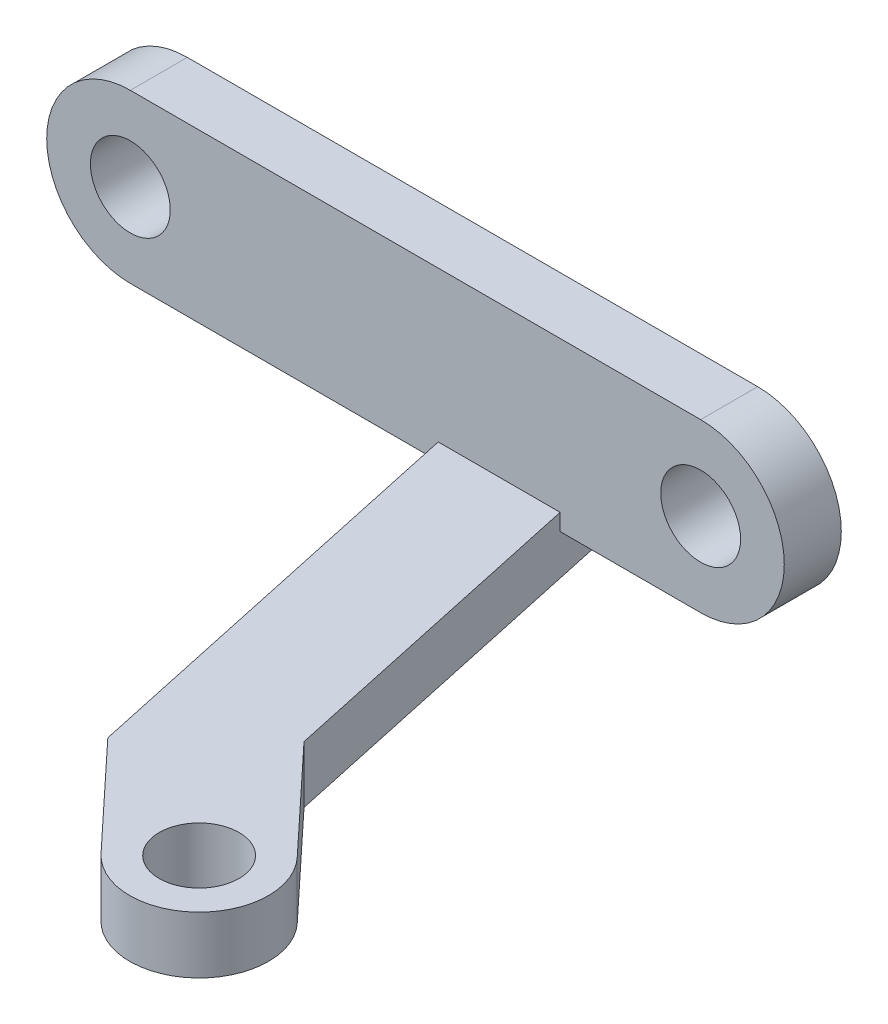
ISO-10303-21;
HEADER;
FILE_DESCRIPTION(('STEP AP214'),'2;1');
FILE_NAME('part.step','',(''),(''),'','','');
FILE_SCHEMA(('AUTOMOTIVE_DESIGN { 1 0 10303 214 1 1 1 1 }'));
ENDSEC;
DATA;
#1=APPLICATION_CONTEXT('core data for automotive mechanical design processes');
#2=APPLICATION_PROTOCOL_DEFINITION('international standard','automotive_design',2000,#1);
#3=PRODUCT_CONTEXT('',#1,'mechanical');
#4=PRODUCT('Part','Part','',(#3));
#5=PRODUCT_RELATED_PRODUCT_CATEGORY('part','',(#4));
#6=PRODUCT_DEFINITION_FORMATION('','',#4);
#7=PRODUCT_DEFINITION_CONTEXT('part definition',#1,'design');
#8=PRODUCT_DEFINITION('design','',#6,#7);
#9=PRODUCT_DEFINITION_SHAPE('','',#8);
#10=(LENGTH_UNIT() NAMED_UNIT(*) SI_UNIT(.MILLI.,.METRE.));
#11=(NAMED_UNIT(*) PLANE_ANGLE_UNIT() SI_UNIT($,.RADIAN.));
#12=(NAMED_UNIT(*) SI_UNIT($,.STERADIAN.) SOLID_ANGLE_UNIT());
#13=UNCERTAINTY_MEASURE_WITH_UNIT(LENGTH_MEASURE(1.E-05),#10,'distance_accuracy_value','');
#14=(GEOMETRIC_REPRESENTATION_CONTEXT(3) GLOBAL_UNCERTAINTY_ASSIGNED_CONTEXT((#13)) GLOBAL_UNIT_ASSIGNED_CONTEXT((#10,
#11,#12)) REPRESENTATION_CONTEXT('',''));
#15=CARTESIAN_POINT('',(0.,0.,0.));
#16=DIRECTION('',(0.,0.,1.));
#17=DIRECTION('',(1.,0.,0.));
#18=AXIS2_PLACEMENT_3D('',#15,#16,#17);
#19=CARTESIAN_POINT('',(-51.4512469253855,1.0464477785419,2.5));
#20=DIRECTION('',(0.,1.,0.));
#21=DIRECTION('',(-1.,0.,0.));
#22=AXIS2_PLACEMENT_3D('',#19,#20,#21);
#23=PLANE('',#22);
#24=DIRECTION('',(1.,0.,0.));
#25=VECTOR('',#24,1.);
#26=CARTESIAN_POINT('',(-51.4512469253855,1.0464477785419,0.));
#27=LINE('',#26,#25);
#28=CARTESIAN_POINT('',(-76.4512469253855,1.0464477785419,0.));
#29=VERTEX_POINT('',#28);
#30=CARTESIAN_POINT('',(-63.492403414898,1.0464477785419,0.));
#31=VERTEX_POINT('',#30);
#32=EDGE_CURVE('E218',#29,#31,#27,.T.);
#33=ORIENTED_EDGE('',*,*,#32,.T.);
#34=DIRECTION('',(0.211022743594743,0.,0.977481151575695));
#35=VECTOR('',#34,1.);
#36=CARTESIAN_POINT('',(-62.4405266259804,1.0464477785419,4.87241193736713));
#37=LINE('',#36,#35);
#38=CARTESIAN_POINT('',(-62.9526928965556,1.0464477785419,2.5));
#39=VERTEX_POINT('',#38);
#40=EDGE_CURVE('E11',#31,#39,#37,.T.);
#41=ORIENTED_EDGE('',*,*,#40,.T.);
#42=DIRECTION('',(1.,0.,0.));
#43=VECTOR('',#42,1.);
#44=CARTESIAN_POINT('',(-51.4512469253855,1.0464477785419,2.5));
#45=LINE('',#44,#43);
#46=CARTESIAN_POINT('',(-76.4512469253855,1.0464477785419,2.5));
#47=VERTEX_POINT('',#46);
#48=EDGE_CURVE('E222',#47,#39,#45,.T.);
#49=ORIENTED_EDGE('',*,*,#48,.F.);
#50=DIRECTION('',(0.,0.,-1.));
#51=VECTOR('',#50,1.);
#52=CARTESIAN_POINT('',(-76.4512469253855,1.0464477785419,2.5));
#53=LINE('',#52,#51);
#54=EDGE_CURVE('E235',#47,#29,#53,.T.);
#55=ORIENTED_EDGE('',*,*,#54,.T.);
#56=EDGE_LOOP('',(#33,#41,#49,#55));
#57=FACE_BOUND('',#56,.T.);
#58=ADVANCED_FACE('F35',(#57),#23,.F.);
#59=CARTESIAN_POINT('',(-51.4512469253855,4.71199999999999,2.5));
#60=DIRECTION('',(0.,0.,1.));
#61=DIRECTION('',(1.,0.,0.));
#62=AXIS2_PLACEMENT_3D('',#59,#60,#61);
#63=PLANE('',#62);
#64=DIRECTION('',(0.,-1.,0.));
#65=VECTOR('',#64,1.);
#66=CARTESIAN_POINT('',(-62.9526928965556,4.71199999999999,2.5));
#67=LINE('',#66,#65);
#68=CARTESIAN_POINT('',(-62.9526928965556,1.77777892340318,2.5));
#69=VERTEX_POINT('',#68);
#70=EDGE_CURVE('E198',#69,#39,#67,.T.);
#71=ORIENTED_EDGE('',*,*,#70,.F.);
#72=DIRECTION('',(1.,0.,0.));
#73=VECTOR('',#72,1.);
#74=CARTESIAN_POINT('',(-51.4512469253855,1.77777892340319,2.5));
#75=LINE('',#74,#73);
#76=CARTESIAN_POINT('',(-57.60992302724,1.77777892340319,2.5));
#77=VERTEX_POINT('',#76);
#78=EDGE_CURVE('E200',#69,#77,#75,.T.);
#79=ORIENTED_EDGE('',*,*,#78,.T.);
#80=DIRECTION('',(0.,1.,0.));
#81=VECTOR('',#80,1.);
#82=CARTESIAN_POINT('',(-57.60992302724,4.71199999999999,2.5));
#83=LINE('',#82,#81);
#84=CARTESIAN_POINT('',(-57.60992302724,1.0464477785419,2.5));
#85=VERTEX_POINT('',#84);
#86=EDGE_CURVE('E145',#85,#77,#83,.T.);
#87=ORIENTED_EDGE('',*,*,#86,.F.);
#88=CARTESIAN_POINT('',(-51.4512469253855,1.0464477785419,2.5));
#89=VERTEX_POINT('',#88);
#90=EDGE_CURVE('E59',#85,#89,#45,.T.);
#91=ORIENTED_EDGE('',*,*,#90,.T.);
#92=CARTESIAN_POINT('',(-51.4512469253855,4.71199999999999,2.5));
#93=DIRECTION('',(0.,0.,1.));
#94=DIRECTION('',(1.,0.,0.));
#95=AXIS2_PLACEMENT_3D('',#92,#93,#94);
#96=CIRCLE('',#95,3.66555222145809);
#97=CARTESIAN_POINT('',(-51.4512469253855,8.37755222145808,2.5));
#98=VERTEX_POINT('',#97);
#99=EDGE_CURVE('E216',#89,#98,#96,.T.);
#100=ORIENTED_EDGE('',*,*,#99,.T.);
#101=DIRECTION('',(-1.,0.,0.));
#102=VECTOR('',#101,1.);
#103=CARTESIAN_POINT('',(-51.4512469253855,8.37755222145808,2.5));
#104=LINE('',#103,#102);
#105=CARTESIAN_POINT('',(-76.4512469253855,8.37755222145809,2.5));
#106=VERTEX_POINT('',#105);
#107=EDGE_CURVE('E88',#98,#106,#104,.T.);
#108=ORIENTED_EDGE('',*,*,#107,.T.);
#109=CARTESIAN_POINT('',(-76.4512469253855,4.71199999999999,2.5));
#110=DIRECTION('',(0.,0.,1.));
#111=DIRECTION('',(1.,0.,0.));
#112=AXIS2_PLACEMENT_3D('',#109,#110,#111);
#113=CIRCLE('',#112,3.66555222145809);
#114=EDGE_CURVE('E220',#106,#47,#113,.T.);
#115=ORIENTED_EDGE('',*,*,#114,.T.);
#116=ORIENTED_EDGE('',*,*,#48,.T.);
#117=EDGE_LOOP('',(#71,#79,#87,#91,#100,#108,#115,#116));
#118=FACE_BOUND('',#117,.T.);
#119=CARTESIAN_POINT('',(-76.4512469253855,4.71199999999999,2.5));
#120=DIRECTION('',(0.,0.,1.));
#121=DIRECTION('',(1.,0.,0.));
#122=AXIS2_PLACEMENT_3D('',#119,#120,#121);
#123=CIRCLE('',#122,1.75);
#124=CARTESIAN_POINT('',(-74.7012469253855,4.71199999999999,2.5));
#125=VERTEX_POINT('',#124);
#126=EDGE_CURVE('E210',#125,#125,#123,.T.);
#127=ORIENTED_EDGE('',*,*,#126,.F.);
#128=EDGE_LOOP('',(#127));
#129=FACE_BOUND('',#128,.T.);
#130=CARTESIAN_POINT('',(-51.4512469253855,4.71199999999999,2.5));
#131=DIRECTION('',(0.,0.,1.));
#132=DIRECTION('',(1.,0.,0.));
#133=AXIS2_PLACEMENT_3D('',#130,#131,#132);
#134=CIRCLE('',#133,1.75000000000001);
#135=CARTESIAN_POINT('',(-49.7012469253855,4.71199999999999,2.5));
#136=VERTEX_POINT('',#135);
#137=EDGE_CURVE('E204',#136,#136,#134,.T.);
#138=ORIENTED_EDGE('',*,*,#137,.F.);
#139=EDGE_LOOP('',(#138));
#140=FACE_BOUND('',#139,.T.);
#141=ADVANCED_FACE('F253',(#118,#129,#140),#63,.T.);
#142=CARTESIAN_POINT('',(-51.4512469253855,4.71199999999999,0.));
#143=DIRECTION('',(0.,0.,1.));
#144=DIRECTION('',(1.,0.,0.));
#145=AXIS2_PLACEMENT_3D('',#142,#143,#144);
#146=PLANE('',#145);
#147=DIRECTION('',(0.,1.,0.));
#148=VECTOR('',#147,1.);
#149=CARTESIAN_POINT('',(-63.492403414898,-0.722221076596819,0.));
#150=LINE('',#149,#148);
#151=CARTESIAN_POINT('',(-63.492403414898,-0.722221076596819,0.));
#152=VERTEX_POINT('',#151);
#153=EDGE_CURVE('E193',#152,#31,#150,.T.);
#154=ORIENTED_EDGE('',*,*,#153,.T.);
#155=ORIENTED_EDGE('',*,*,#32,.F.);
#156=CARTESIAN_POINT('',(-76.4512469253855,4.71199999999999,0.));
#157=DIRECTION('',(0.,0.,1.));
#158=DIRECTION('',(1.,0.,0.));
#159=AXIS2_PLACEMENT_3D('',#156,#157,#158);
#160=CIRCLE('',#159,3.66555222145809);
#161=CARTESIAN_POINT('',(-76.4512469253855,8.37755222145809,0.));
#162=VERTEX_POINT('',#161);
#163=EDGE_CURVE('E230',#162,#29,#160,.T.);
#164=ORIENTED_EDGE('',*,*,#163,.F.);
#165=DIRECTION('',(-1.,0.,0.));
#166=VECTOR('',#165,1.);
#167=CARTESIAN_POINT('',(-51.4512469253855,8.37755222145808,0.));
#168=LINE('',#167,#166);
#169=CARTESIAN_POINT('',(-51.4512469253855,8.37755222145808,0.));
#170=VERTEX_POINT('',#169);
#171=EDGE_CURVE('E228',#170,#162,#168,.T.);
#172=ORIENTED_EDGE('',*,*,#171,.F.);
#173=CARTESIAN_POINT('',(-51.4512469253855,4.71199999999999,0.));
#174=DIRECTION('',(0.,0.,1.));
#175=DIRECTION('',(1.,0.,0.));
#176=AXIS2_PLACEMENT_3D('',#173,#174,#175);
#177=CIRCLE('',#176,3.66555222145809);
#178=CARTESIAN_POINT('',(-51.4512469253855,1.0464477785419,0.));
#179=VERTEX_POINT('',#178);
#180=EDGE_CURVE('E213',#179,#170,#177,.T.);
#181=ORIENTED_EDGE('',*,*,#180,.F.);
#182=CARTESIAN_POINT('',(-58.1496335455825,1.0464477785419,0.));
#183=VERTEX_POINT('',#182);
#184=EDGE_CURVE('E80',#183,#179,#27,.T.);
#185=ORIENTED_EDGE('',*,*,#184,.F.);
#186=DIRECTION('',(0.,1.,0.));
#187=VECTOR('',#186,1.);
#188=CARTESIAN_POINT('',(-58.1496335455824,-0.722221076596816,0.));
#189=LINE('',#188,#187);
#190=CARTESIAN_POINT('',(-58.1496335455824,-0.722221076596816,0.));
#191=VERTEX_POINT('',#190);
#192=EDGE_CURVE('E50',#191,#183,#189,.T.);
#193=ORIENTED_EDGE('',*,*,#192,.F.);
#194=DIRECTION('',(-1.,0.,0.));
#195=VECTOR('',#194,1.);
#196=CARTESIAN_POINT('',(0.,-0.722221076596789,0.));
#197=LINE('',#196,#195);
#198=EDGE_CURVE('E164',#191,#152,#197,.T.);
#199=ORIENTED_EDGE('',*,*,#198,.T.);
#200=EDGE_LOOP('',(#154,#155,#164,#172,#181,#185,#193,#199));
#201=FACE_BOUND('',#200,.T.);
#202=CARTESIAN_POINT('',(-76.4512469253855,4.71199999999999,0.));
#203=DIRECTION('',(0.,0.,1.));
#204=DIRECTION('',(1.,0.,0.));
#205=AXIS2_PLACEMENT_3D('',#202,#203,#204);
#206=CIRCLE('',#205,1.75);
#207=CARTESIAN_POINT('',(-74.7012469253855,4.71199999999999,0.));
#208=VERTEX_POINT('',#207);
#209=EDGE_CURVE('E207',#208,#208,#206,.T.);
#210=ORIENTED_EDGE('',*,*,#209,.T.);
#211=EDGE_LOOP('',(#210));
#212=FACE_BOUND('',#211,.T.);
#213=CARTESIAN_POINT('',(-51.4512469253855,4.71199999999999,0.));
#214=DIRECTION('',(0.,0.,1.));
#215=DIRECTION('',(1.,0.,0.));
#216=AXIS2_PLACEMENT_3D('',#213,#214,#215);
#217=CIRCLE('',#216,1.75000000000001);
#218=CARTESIAN_POINT('',(-49.7012469253855,4.71199999999999,0.));
#219=VERTEX_POINT('',#218);
#220=EDGE_CURVE('E203',#219,#219,#217,.T.);
#221=ORIENTED_EDGE('',*,*,#220,.T.);
#222=EDGE_LOOP('',(#221));
#223=FACE_BOUND('',#222,.T.);
#224=ADVANCED_FACE('F245',(#201,#212,#223),#146,.F.);
#225=CARTESIAN_POINT('',(-51.4512469253855,4.71199999999999,2.5));
#226=DIRECTION('',(0.,0.,-1.));
#227=DIRECTION('',(-1.,0.,0.));
#228=AXIS2_PLACEMENT_3D('',#225,#226,#227);
#229=CYLINDRICAL_SURFACE('',#228,3.66555222145809);
#230=ORIENTED_EDGE('',*,*,#180,.T.);
#231=DIRECTION('',(0.,0.,-1.));
#232=VECTOR('',#231,1.);
#233=CARTESIAN_POINT('',(-51.4512469253855,8.37755222145808,2.5));
#234=LINE('',#233,#232);
#235=EDGE_CURVE('E241',#98,#170,#234,.T.);
#236=ORIENTED_EDGE('',*,*,#235,.F.);
#237=ORIENTED_EDGE('',*,*,#99,.F.);
#238=DIRECTION('',(0.,0.,-1.));
#239=VECTOR('',#238,1.);
#240=CARTESIAN_POINT('',(-51.4512469253855,1.0464477785419,2.5));
#241=LINE('',#240,#239);
#242=EDGE_CURVE('E225',#89,#179,#241,.T.);
#243=ORIENTED_EDGE('',*,*,#242,.T.);
#244=EDGE_LOOP('',(#230,#236,#237,#243));
#245=FACE_BOUND('',#244,.T.);
#246=ADVANCED_FACE('F37',(#245),#229,.T.);
#247=CARTESIAN_POINT('',(-51.4512469253855,8.37755222145808,2.5));
#248=DIRECTION('',(0.,-1.,0.));
#249=DIRECTION('',(1.,0.,0.));
#250=AXIS2_PLACEMENT_3D('',#247,#248,#249);
#251=PLANE('',#250);
#252=ORIENTED_EDGE('',*,*,#171,.T.);
#253=DIRECTION('',(0.,0.,-1.));
#254=VECTOR('',#253,1.);
#255=CARTESIAN_POINT('',(-76.4512469253855,8.37755222145809,2.5));
#256=LINE('',#255,#254);
#257=EDGE_CURVE('E238',#106,#162,#256,.T.);
#258=ORIENTED_EDGE('',*,*,#257,.F.);
#259=ORIENTED_EDGE('',*,*,#107,.F.);
#260=ORIENTED_EDGE('',*,*,#235,.T.);
#261=EDGE_LOOP('',(#252,#258,#259,#260));
#262=FACE_BOUND('',#261,.T.);
#263=ADVANCED_FACE('F257',(#262),#251,.F.);
#264=CARTESIAN_POINT('',(-76.4512469253855,4.71199999999999,2.5));
#265=DIRECTION('',(0.,0.,-1.));
#266=DIRECTION('',(-1.,0.,0.));
#267=AXIS2_PLACEMENT_3D('',#264,#265,#266);
#268=CYLINDRICAL_SURFACE('',#267,3.66555222145809);
#269=ORIENTED_EDGE('',*,*,#163,.T.);
#270=ORIENTED_EDGE('',*,*,#54,.F.);
#271=ORIENTED_EDGE('',*,*,#114,.F.);
#272=ORIENTED_EDGE('',*,*,#257,.T.);
#273=EDGE_LOOP('',(#269,#270,#271,#272));
#274=FACE_BOUND('',#273,.T.);
#275=ADVANCED_FACE('F259',(#274),#268,.T.);
#276=ORIENTED_EDGE('',*,*,#90,.F.);
#277=DIRECTION('',(-0.211022743594743,0.,-0.977481151575695));
#278=VECTOR('',#277,1.);
#279=CARTESIAN_POINT('',(-57.3356734956008,1.0464477785419,3.7703547657435));
#280=LINE('',#279,#278);
#281=EDGE_CURVE('E43',#85,#183,#280,.T.);
#282=ORIENTED_EDGE('',*,*,#281,.T.);
#283=ORIENTED_EDGE('',*,*,#184,.T.);
#284=ORIENTED_EDGE('',*,*,#242,.F.);
#285=EDGE_LOOP('',(#276,#282,#283,#284));
#286=FACE_BOUND('',#285,.T.);
#287=ADVANCED_FACE('F242',(#286),#23,.F.);
#288=CARTESIAN_POINT('',(-76.4512469253855,4.71199999999999,2.5));
#289=DIRECTION('',(0.,0.,-1.));
#290=DIRECTION('',(-1.,0.,0.));
#291=AXIS2_PLACEMENT_3D('',#288,#289,#290);
#292=CYLINDRICAL_SURFACE('',#291,1.75);
#293=ORIENTED_EDGE('',*,*,#126,.T.);
#294=EDGE_LOOP('',(#293));
#295=FACE_BOUND('',#294,.T.);
#296=ORIENTED_EDGE('',*,*,#209,.F.);
#297=EDGE_LOOP('',(#296));
#298=FACE_BOUND('',#297,.T.);
#299=ADVANCED_FACE('F293',(#295,#298),#292,.F.);
#300=CARTESIAN_POINT('',(-51.4512469253855,4.71199999999999,2.5));
#301=DIRECTION('',(0.,0.,-1.));
#302=DIRECTION('',(-1.,0.,0.));
#303=AXIS2_PLACEMENT_3D('',#300,#301,#302);
#304=CYLINDRICAL_SURFACE('',#303,1.75000000000001);
#305=ORIENTED_EDGE('',*,*,#137,.T.);
#306=EDGE_LOOP('',(#305));
#307=FACE_BOUND('',#306,.T.);
#308=ORIENTED_EDGE('',*,*,#220,.F.);
#309=EDGE_LOOP('',(#308));
#310=FACE_BOUND('',#309,.T.);
#311=ADVANCED_FACE('F298',(#307,#310),#304,.F.);
#312=CARTESIAN_POINT('',(-52.4946069427896,-0.722221076596803,23.4402521377787));
#313=DIRECTION('',(0.,1.,0.));
#314=DIRECTION('',(-1.,0.,0.));
#315=AXIS2_PLACEMENT_3D('',#312,#313,#314);
#316=CYLINDRICAL_SURFACE('',#315,3.04255287602145);
#317=CARTESIAN_POINT('',(-52.4946069427896,1.7777789234032,23.4402521377787));
#318=DIRECTION('',(0.,-1.,0.));
#319=DIRECTION('',(1.,0.,0.));
#320=AXIS2_PLACEMENT_3D('',#317,#318,#319);
#321=CIRCLE('',#320,3.04255287602145);
#322=CARTESIAN_POINT('',(-54.7174990692925,1.7777789234032,25.5177214148843));
#323=VERTEX_POINT('',#322);
#324=CARTESIAN_POINT('',(-50.2717148162866,1.7777789234032,21.3627828606731));
#325=VERTEX_POINT('',#324);
#326=EDGE_CURVE('E140',#323,#325,#321,.F.);
#327=ORIENTED_EDGE('',*,*,#326,.F.);
#328=DIRECTION('',(0.,1.,0.));
#329=VECTOR('',#328,1.);
#330=CARTESIAN_POINT('',(-54.7174990692925,-0.722221076596803,25.5177214148843));
#331=LINE('',#330,#329);
#332=CARTESIAN_POINT('',(-54.7174990692925,-0.722221076596803,25.5177214148843));
#333=VERTEX_POINT('',#332);
#334=EDGE_CURVE('E134',#333,#323,#331,.T.);
#335=ORIENTED_EDGE('',*,*,#334,.F.);
#336=CARTESIAN_POINT('',(-52.4946069427896,-0.722221076596803,23.4402521377787));
#337=DIRECTION('',(0.,-1.,0.));
#338=DIRECTION('',(1.,0.,0.));
#339=AXIS2_PLACEMENT_3D('',#336,#337,#338);
#340=CIRCLE('',#339,3.04255287602145);
#341=CARTESIAN_POINT('',(-50.2717148162866,-0.722221076596803,21.3627828606731));
#342=VERTEX_POINT('',#341);
#343=EDGE_CURVE('E137',#333,#342,#340,.F.);
#344=ORIENTED_EDGE('',*,*,#343,.T.);
#345=DIRECTION('',(0.,1.,0.));
#346=VECTOR('',#345,1.);
#347=CARTESIAN_POINT('',(-50.2717148162866,-0.722221076596803,21.3627828606731));
#348=LINE('',#347,#346);
#349=EDGE_CURVE('E175',#342,#325,#348,.T.);
#350=ORIENTED_EDGE('',*,*,#349,.T.);
#351=EDGE_LOOP('',(#327,#335,#344,#350));
#352=FACE_BOUND('',#351,.T.);
#353=ADVANCED_FACE('F136',(#352),#316,.T.);
#354=CARTESIAN_POINT('',(-41.9366994257817,-0.722221076596791,39.1931770334409));
#355=DIRECTION('',(-0.730600984463315,0.,0.682804658376929));
#356=DIRECTION('',(0.682804658376929,0.,0.730600984463315));
#357=AXIS2_PLACEMENT_3D('',#354,#355,#356);
#358=PLANE('',#357);
#359=DIRECTION('',(0.682804658376929,0.,0.730600984463315));
#360=VECTOR('',#359,1.);
#361=CARTESIAN_POINT('',(-41.9366994257817,1.77777892340321,39.1931770334409));
#362=LINE('',#361,#360);
#363=CARTESIAN_POINT('',(-58.9645923451097,1.77777892340319,20.97333160976));
#364=VERTEX_POINT('',#363);
#365=EDGE_CURVE('E177',#364,#323,#362,.T.);
#366=ORIENTED_EDGE('',*,*,#365,.F.);
#367=DIRECTION('',(0.,1.,0.));
#368=VECTOR('',#367,1.);
#369=CARTESIAN_POINT('',(-58.9645923451097,-0.722221076596807,20.97333160976));
#370=LINE('',#369,#368);
#371=CARTESIAN_POINT('',(-58.9645923451097,-0.722221076596807,20.97333160976));
#372=VERTEX_POINT('',#371);
#373=EDGE_CURVE('E146',#372,#364,#370,.T.);
#374=ORIENTED_EDGE('',*,*,#373,.F.);
#375=DIRECTION('',(0.682804658376929,0.,0.730600984463315));
#376=VECTOR('',#375,1.);
#377=CARTESIAN_POINT('',(-41.9366994257817,-0.722221076596791,39.1931770334409));
#378=LINE('',#377,#376);
#379=EDGE_CURVE('E153',#372,#333,#378,.T.);
#380=ORIENTED_EDGE('',*,*,#379,.T.);
#381=ORIENTED_EDGE('',*,*,#334,.T.);
#382=EDGE_LOOP('',(#366,#374,#380,#381));
#383=FACE_BOUND('',#382,.T.);
#384=ADVANCED_FACE('F160',(#383),#358,.T.);
#385=CARTESIAN_POINT('',(-60.6650487024227,-0.722221076596811,13.0966259521809));
#386=DIRECTION('',(-0.977481151575695,0.,0.211022743594743));
#387=DIRECTION('',(0.211022743594743,0.,0.977481151575695));
#388=AXIS2_PLACEMENT_3D('',#385,#386,#387);
#389=PLANE('',#388);
#390=DIRECTION('',(0.211022743594743,0.,0.977481151575695));
#391=VECTOR('',#390,1.);
#392=CARTESIAN_POINT('',(-60.6650487024227,1.77777892340319,13.0966259521809));
#393=LINE('',#392,#391);
#394=EDGE_CURVE('E179',#69,#364,#393,.T.);
#395=ORIENTED_EDGE('',*,*,#394,.F.);
#396=ORIENTED_EDGE('',*,*,#70,.T.);
#397=ORIENTED_EDGE('',*,*,#40,.F.);
#398=ORIENTED_EDGE('',*,*,#153,.F.);
#399=DIRECTION('',(0.211022743594743,0.,0.977481151575695));
#400=VECTOR('',#399,1.);
#401=CARTESIAN_POINT('',(-60.6650487024227,-0.722221076596811,13.0966259521809));
#402=LINE('',#401,#400);
#403=EDGE_CURVE('E162',#152,#372,#402,.T.);
#404=ORIENTED_EDGE('',*,*,#403,.T.);
#405=ORIENTED_EDGE('',*,*,#373,.T.);
#406=EDGE_LOOP('',(#395,#396,#397,#398,#404,#405));
#407=FACE_BOUND('',#406,.T.);
#408=ADVANCED_FACE('F265',(#407),#389,.T.);
#409=CARTESIAN_POINT('',(-55.5601955720431,-0.72222107659681,11.9945687805573));
#410=DIRECTION('',(0.977481151575695,0.,-0.211022743594743));
#411=DIRECTION('',(-0.211022743594743,0.,-0.977481151575695));
#412=AXIS2_PLACEMENT_3D('',#409,#410,#411);
#413=PLANE('',#412);
#414=ORIENTED_EDGE('',*,*,#281,.F.);
#415=ORIENTED_EDGE('',*,*,#86,.T.);
#416=DIRECTION('',(-0.211022743594743,0.,-0.977481151575695));
#417=VECTOR('',#416,1.);
#418=CARTESIAN_POINT('',(-55.5601955720431,1.77777892340319,11.9945687805573));
#419=LINE('',#418,#417);
#420=CARTESIAN_POINT('',(-54.5188080921038,1.77777892340319,16.8183930555488));
#421=VERTEX_POINT('',#420);
#422=EDGE_CURVE('E181',#421,#77,#419,.T.);
#423=ORIENTED_EDGE('',*,*,#422,.F.);
#424=DIRECTION('',(0.,1.,0.));
#425=VECTOR('',#424,1.);
#426=CARTESIAN_POINT('',(-54.5188080921038,-0.722221076596807,16.8183930555488));
#427=LINE('',#426,#425);
#428=CARTESIAN_POINT('',(-54.5188080921038,-0.722221076596807,16.8183930555488));
#429=VERTEX_POINT('',#428);
#430=EDGE_CURVE('E190',#429,#421,#427,.T.);
#431=ORIENTED_EDGE('',*,*,#430,.F.);
#432=DIRECTION('',(-0.211022743594743,0.,-0.977481151575695));
#433=VECTOR('',#432,1.);
#434=CARTESIAN_POINT('',(-55.5601955720431,-0.72222107659681,11.9945687805573));
#435=LINE('',#434,#433);
#436=EDGE_CURVE('E169',#429,#191,#435,.T.);
#437=ORIENTED_EDGE('',*,*,#436,.T.);
#438=ORIENTED_EDGE('',*,*,#192,.T.);
#439=EDGE_LOOP('',(#414,#415,#423,#431,#437,#438));
#440=FACE_BOUND('',#439,.T.);
#441=ADVANCED_FACE('F271',(#440),#413,.T.);
#442=CARTESIAN_POINT('',(-37.4909151727758,-0.722221076596791,35.0382384792297));
#443=DIRECTION('',(0.730600984463315,0.,-0.682804658376929));
#444=DIRECTION('',(-0.682804658376929,0.,-0.730600984463315));
#445=AXIS2_PLACEMENT_3D('',#442,#443,#444);
#446=PLANE('',#445);
#447=DIRECTION('',(-0.682804658376929,0.,-0.730600984463315));
#448=VECTOR('',#447,1.);
#449=CARTESIAN_POINT('',(-37.4909151727758,1.77777892340321,35.0382384792297));
#450=LINE('',#449,#448);
#451=EDGE_CURVE('E184',#325,#421,#450,.T.);
#452=ORIENTED_EDGE('',*,*,#451,.F.);
#453=ORIENTED_EDGE('',*,*,#349,.F.);
#454=DIRECTION('',(-0.682804658376929,0.,-0.730600984463315));
#455=VECTOR('',#454,1.);
#456=CARTESIAN_POINT('',(-37.4909151727758,-0.722221076596791,35.0382384792297));
#457=LINE('',#456,#455);
#458=EDGE_CURVE('E157',#342,#429,#457,.T.);
#459=ORIENTED_EDGE('',*,*,#458,.T.);
#460=ORIENTED_EDGE('',*,*,#430,.T.);
#461=EDGE_LOOP('',(#452,#453,#459,#460));
#462=FACE_BOUND('',#461,.T.);
#463=ADVANCED_FACE('F273',(#462),#446,.T.);
#464=CARTESIAN_POINT('',(-52.4946069427895,-0.722221076596803,23.4402521377787));
#465=DIRECTION('',(0.,1.,0.));
#466=DIRECTION('',(-1.,0.,0.));
#467=AXIS2_PLACEMENT_3D('',#464,#465,#466);
#468=CYLINDRICAL_SURFACE('',#467,1.75000000000001);
#469=CARTESIAN_POINT('',(-52.4946069427895,-0.722221076596803,23.4402521377787));
#470=DIRECTION('',(0.,-1.,0.));
#471=DIRECTION('',(1.,0.,0.));
#472=AXIS2_PLACEMENT_3D('',#469,#470,#471);
#473=CIRCLE('',#472,1.75000000000001);
#474=CARTESIAN_POINT('',(-50.7446069427895,-0.722221076596802,23.4402521377787));
#475=VERTEX_POINT('',#474);
#476=EDGE_CURVE('E172',#475,#475,#473,.F.);
#477=ORIENTED_EDGE('',*,*,#476,.F.);
#478=EDGE_LOOP('',(#477));
#479=FACE_BOUND('',#478,.T.);
#480=CARTESIAN_POINT('',(-52.4946069427895,1.7777789234032,23.4402521377787));
#481=DIRECTION('',(0.,-1.,0.));
#482=DIRECTION('',(1.,0.,0.));
#483=AXIS2_PLACEMENT_3D('',#480,#481,#482);
#484=CIRCLE('',#483,1.75000000000001);
#485=CARTESIAN_POINT('',(-50.7446069427895,1.7777789234032,23.4402521377787));
#486=VERTEX_POINT('',#485);
#487=EDGE_CURVE('E158',#486,#486,#484,.F.);
#488=ORIENTED_EDGE('',*,*,#487,.T.);
#489=EDGE_LOOP('',(#488));
#490=FACE_BOUND('',#489,.T.);
#491=ADVANCED_FACE('F275',(#479,#490),#468,.F.);
#492=CARTESIAN_POINT('',(0.,-0.722221076596789,0.));
#493=DIRECTION('',(0.,-1.,0.));
#494=DIRECTION('',(1.,0.,0.));
#495=AXIS2_PLACEMENT_3D('',#492,#493,#494);
#496=PLANE('',#495);
#497=ORIENTED_EDGE('',*,*,#343,.F.);
#498=ORIENTED_EDGE('',*,*,#379,.F.);
#499=ORIENTED_EDGE('',*,*,#403,.F.);
#500=ORIENTED_EDGE('',*,*,#198,.F.);
#501=ORIENTED_EDGE('',*,*,#436,.F.);
#502=ORIENTED_EDGE('',*,*,#458,.F.);
#503=EDGE_LOOP('',(#497,#498,#499,#500,#501,#502));
#504=FACE_BOUND('',#503,.T.);
#505=ORIENTED_EDGE('',*,*,#476,.T.);
#506=EDGE_LOOP('',(#505));
#507=FACE_BOUND('',#506,.T.);
#508=ADVANCED_FACE('F150',(#504,#507),#496,.T.);
#509=CARTESIAN_POINT('',(0.,1.77777892340321,0.));
#510=DIRECTION('',(0.,-1.,0.));
#511=DIRECTION('',(1.,0.,0.));
#512=AXIS2_PLACEMENT_3D('',#509,#510,#511);
#513=PLANE('',#512);
#514=ORIENTED_EDGE('',*,*,#78,.F.);
#515=ORIENTED_EDGE('',*,*,#394,.T.);
#516=ORIENTED_EDGE('',*,*,#365,.T.);
#517=ORIENTED_EDGE('',*,*,#326,.T.);
#518=ORIENTED_EDGE('',*,*,#451,.T.);
#519=ORIENTED_EDGE('',*,*,#422,.T.);
#520=EDGE_LOOP('',(#514,#515,#516,#517,#518,#519));
#521=FACE_BOUND('',#520,.T.);
#522=ORIENTED_EDGE('',*,*,#487,.F.);
#523=EDGE_LOOP('',(#522));
#524=FACE_BOUND('',#523,.T.);
#525=ADVANCED_FACE('F267',(#521,#524),#513,.F.);
#526=CLOSED_SHELL('',(#58,#141,#224,#246,#263,#275,#287,#299,#311,#353,#384,#408,#441,#463,#491,
#508,#525));
#527=MANIFOLD_SOLID_BREP('B2',#526);
#528=ADVANCED_BREP_SHAPE_REPRESENTATION('',(#18,#527),#14);
#529=SHAPE_DEFINITION_REPRESENTATION(#9,#528);
ENDSEC;
END-ISO-10303-21;
